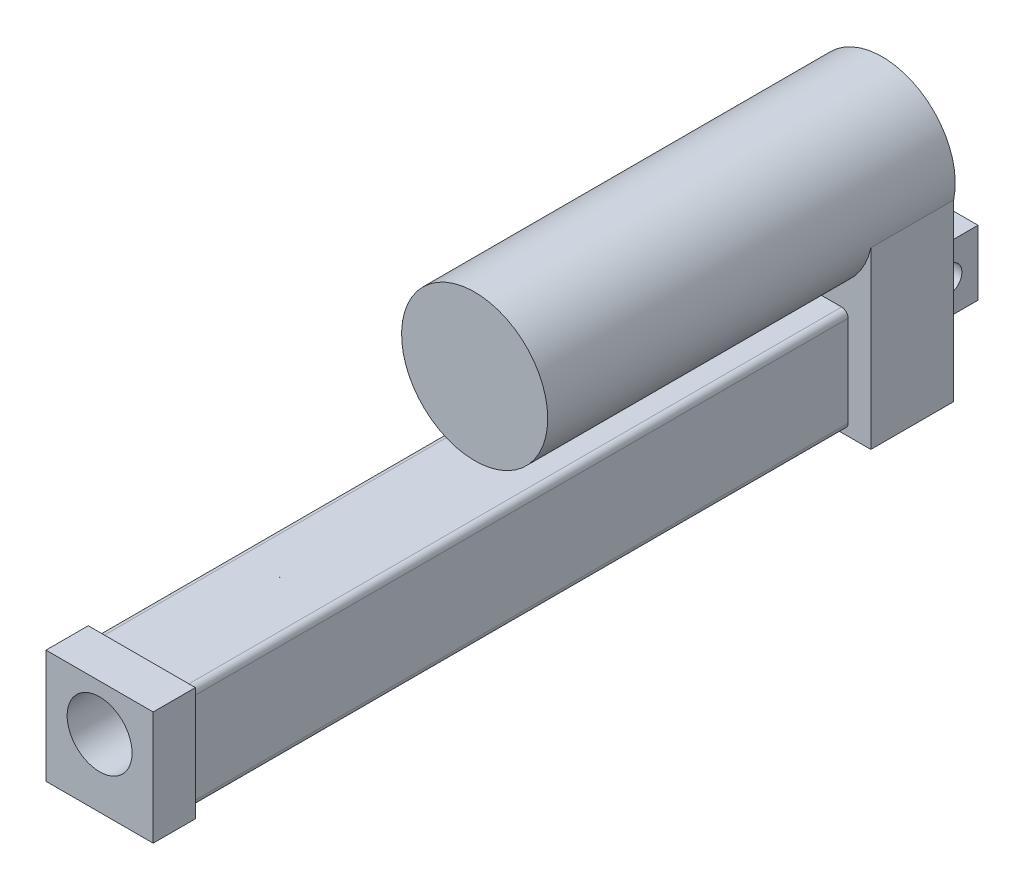
ISO-10303-21;
HEADER;
FILE_DESCRIPTION(('STEP AP214'),'2;1');
FILE_NAME('part.step','',(''),(''),'','','');
FILE_SCHEMA(('AUTOMOTIVE_DESIGN { 1 0 10303 214 1 1 1 1 }'));
ENDSEC;
DATA;
#1=APPLICATION_CONTEXT('core data for automotive mechanical design processes');
#2=APPLICATION_PROTOCOL_DEFINITION('international standard','automotive_design',2000,#1);
#3=PRODUCT_CONTEXT('',#1,'mechanical');
#4=PRODUCT('Part','Part','',(#3));
#5=PRODUCT_RELATED_PRODUCT_CATEGORY('part','',(#4));
#6=PRODUCT_DEFINITION_FORMATION('','',#4);
#7=PRODUCT_DEFINITION_CONTEXT('part definition',#1,'design');
#8=PRODUCT_DEFINITION('design','',#6,#7);
#9=PRODUCT_DEFINITION_SHAPE('','',#8);
#10=(LENGTH_UNIT() NAMED_UNIT(*) SI_UNIT(.MILLI.,.METRE.));
#11=(NAMED_UNIT(*) PLANE_ANGLE_UNIT() SI_UNIT($,.RADIAN.));
#12=(NAMED_UNIT(*) SI_UNIT($,.STERADIAN.) SOLID_ANGLE_UNIT());
#13=UNCERTAINTY_MEASURE_WITH_UNIT(LENGTH_MEASURE(1.E-05),#10,'distance_accuracy_value','');
#14=(GEOMETRIC_REPRESENTATION_CONTEXT(3) GLOBAL_UNCERTAINTY_ASSIGNED_CONTEXT((#13)) GLOBAL_UNIT_ASSIGNED_CONTEXT((#10,
#11,#12)) REPRESENTATION_CONTEXT('',''));
#15=CARTESIAN_POINT('',(0.,0.,0.));
#16=DIRECTION('',(0.,0.,1.));
#17=DIRECTION('',(1.,0.,0.));
#18=AXIS2_PLACEMENT_3D('',#15,#16,#17);
#19=CARTESIAN_POINT('',(15.,-57.,241.));
#20=DIRECTION('',(-1.,0.,0.));
#21=DIRECTION('',(0.,-1.,0.));
#22=AXIS2_PLACEMENT_3D('',#19,#20,#21);
#23=PLANE('',#22);
#24=DIRECTION('',(0.,1.,0.));
#25=VECTOR('',#24,1.);
#26=CARTESIAN_POINT('',(15.,-57.,228.));
#27=LINE('',#26,#25);
#28=CARTESIAN_POINT('',(15.,-55.,228.));
#29=VERTEX_POINT('',#28);
#30=CARTESIAN_POINT('',(15.,-27.,228.));
#31=VERTEX_POINT('',#30);
#32=EDGE_CURVE('E222',#29,#31,#27,.T.);
#33=ORIENTED_EDGE('',*,*,#32,.F.);
#34=DIRECTION('',(0.,0.,-1.));
#35=VECTOR('',#34,1.);
#36=CARTESIAN_POINT('',(15.,-55.,241.));
#37=LINE('',#36,#35);
#38=CARTESIAN_POINT('',(15.,-55.,25.5));
#39=VERTEX_POINT('',#38);
#40=EDGE_CURVE('E323',#29,#39,#37,.T.);
#41=ORIENTED_EDGE('',*,*,#40,.T.);
#42=DIRECTION('',(0.,1.,0.));
#43=VECTOR('',#42,1.);
#44=CARTESIAN_POINT('',(15.,-57.,25.5));
#45=LINE('',#44,#43);
#46=CARTESIAN_POINT('',(15.,-27.,25.5));
#47=VERTEX_POINT('',#46);
#48=EDGE_CURVE('E264',#39,#47,#45,.T.);
#49=ORIENTED_EDGE('',*,*,#48,.T.);
#50=DIRECTION('',(0.,0.,-1.));
#51=VECTOR('',#50,1.);
#52=CARTESIAN_POINT('',(15.,-27.,241.));
#53=LINE('',#52,#51);
#54=EDGE_CURVE('E321',#47,#31,#53,.F.);
#55=ORIENTED_EDGE('',*,*,#54,.T.);
#56=EDGE_LOOP('',(#33,#41,#49,#55));
#57=FACE_BOUND('',#56,.T.);
#58=ADVANCED_FACE('F33',(#57),#23,.F.);
#59=CARTESIAN_POINT('',(-15.,-25.,241.));
#60=DIRECTION('',(0.,-1.,0.));
#61=DIRECTION('',(0.,0.,-1.));
#62=AXIS2_PLACEMENT_3D('',#59,#60,#61);
#63=PLANE('',#62);
#64=DIRECTION('',(-1.,0.,0.));
#65=VECTOR('',#64,1.);
#66=CARTESIAN_POINT('',(-15.,-25.,25.5));
#67=LINE('',#66,#65);
#68=CARTESIAN_POINT('',(13.,-25.,25.5));
#69=VERTEX_POINT('',#68);
#70=CARTESIAN_POINT('',(-13.,-25.,25.5));
#71=VERTEX_POINT('',#70);
#72=EDGE_CURVE('E267',#69,#71,#67,.T.);
#73=ORIENTED_EDGE('',*,*,#72,.T.);
#74=DIRECTION('',(0.,0.,-1.));
#75=VECTOR('',#74,1.);
#76=CARTESIAN_POINT('',(-13.,-25.,241.));
#77=LINE('',#76,#75);
#78=CARTESIAN_POINT('',(-13.,-25.,228.));
#79=VERTEX_POINT('',#78);
#80=EDGE_CURVE('E328',#71,#79,#77,.F.);
#81=ORIENTED_EDGE('',*,*,#80,.T.);
#82=DIRECTION('',(-1.,0.,0.));
#83=VECTOR('',#82,1.);
#84=CARTESIAN_POINT('',(-15.,-25.,228.));
#85=LINE('',#84,#83);
#86=CARTESIAN_POINT('',(13.,-25.,228.));
#87=VERTEX_POINT('',#86);
#88=EDGE_CURVE('E219',#87,#79,#85,.T.);
#89=ORIENTED_EDGE('',*,*,#88,.F.);
#90=DIRECTION('',(0.,0.,-1.));
#91=VECTOR('',#90,1.);
#92=CARTESIAN_POINT('',(13.,-25.,241.));
#93=LINE('',#92,#91);
#94=EDGE_CURVE('E326',#87,#69,#93,.T.);
#95=ORIENTED_EDGE('',*,*,#94,.T.);
#96=EDGE_LOOP('',(#73,#81,#89,#95));
#97=FACE_BOUND('',#96,.T.);
#98=ADVANCED_FACE('F349',(#97),#63,.F.);
#99=CARTESIAN_POINT('',(-15.,-57.,241.));
#100=DIRECTION('',(1.,0.,0.));
#101=DIRECTION('',(0.,0.,-1.));
#102=AXIS2_PLACEMENT_3D('',#99,#100,#101);
#103=PLANE('',#102);
#104=DIRECTION('',(0.,-1.,0.));
#105=VECTOR('',#104,1.);
#106=CARTESIAN_POINT('',(-15.,-57.,25.5));
#107=LINE('',#106,#105);
#108=CARTESIAN_POINT('',(-15.,-27.,25.5));
#109=VERTEX_POINT('',#108);
#110=CARTESIAN_POINT('',(-15.,-55.,25.5));
#111=VERTEX_POINT('',#110);
#112=EDGE_CURVE('E269',#109,#111,#107,.T.);
#113=ORIENTED_EDGE('',*,*,#112,.T.);
#114=DIRECTION('',(0.,0.,-1.));
#115=VECTOR('',#114,1.);
#116=CARTESIAN_POINT('',(-15.,-55.,241.));
#117=LINE('',#116,#115);
#118=CARTESIAN_POINT('',(-15.,-55.,228.));
#119=VERTEX_POINT('',#118);
#120=EDGE_CURVE('E319',#111,#119,#117,.F.);
#121=ORIENTED_EDGE('',*,*,#120,.T.);
#122=DIRECTION('',(0.,-1.,0.));
#123=VECTOR('',#122,1.);
#124=CARTESIAN_POINT('',(-15.,-57.,228.));
#125=LINE('',#124,#123);
#126=CARTESIAN_POINT('',(-15.,-27.,228.));
#127=VERTEX_POINT('',#126);
#128=EDGE_CURVE('E213',#127,#119,#125,.T.);
#129=ORIENTED_EDGE('',*,*,#128,.F.);
#130=DIRECTION('',(0.,0.,-1.));
#131=VECTOR('',#130,1.);
#132=CARTESIAN_POINT('',(-15.,-27.,241.));
#133=LINE('',#132,#131);
#134=EDGE_CURVE('E316',#127,#109,#133,.T.);
#135=ORIENTED_EDGE('',*,*,#134,.T.);
#136=EDGE_LOOP('',(#113,#121,#129,#135));
#137=FACE_BOUND('',#136,.T.);
#138=ADVANCED_FACE('F357',(#137),#103,.F.);
#139=CARTESIAN_POINT('',(-15.,-57.,241.));
#140=DIRECTION('',(0.,1.,0.));
#141=DIRECTION('',(0.,0.,1.));
#142=AXIS2_PLACEMENT_3D('',#139,#140,#141);
#143=PLANE('',#142);
#144=DIRECTION('',(1.,0.,0.));
#145=VECTOR('',#144,1.);
#146=CARTESIAN_POINT('',(-15.,-57.,228.));
#147=LINE('',#146,#145);
#148=CARTESIAN_POINT('',(-13.,-57.,228.));
#149=VERTEX_POINT('',#148);
#150=CARTESIAN_POINT('',(13.,-57.,228.));
#151=VERTEX_POINT('',#150);
#152=EDGE_CURVE('E308',#149,#151,#147,.T.);
#153=ORIENTED_EDGE('',*,*,#152,.F.);
#154=DIRECTION('',(0.,0.,-1.));
#155=VECTOR('',#154,1.);
#156=CARTESIAN_POINT('',(-13.,-57.,241.));
#157=LINE('',#156,#155);
#158=CARTESIAN_POINT('',(-13.,-57.,25.5));
#159=VERTEX_POINT('',#158);
#160=EDGE_CURVE('E313',#149,#159,#157,.T.);
#161=ORIENTED_EDGE('',*,*,#160,.T.);
#162=DIRECTION('',(1.,0.,0.));
#163=VECTOR('',#162,1.);
#164=CARTESIAN_POINT('',(-15.,-57.,25.5));
#165=LINE('',#164,#163);
#166=CARTESIAN_POINT('',(13.,-57.,25.5));
#167=VERTEX_POINT('',#166);
#168=EDGE_CURVE('E272',#159,#167,#165,.T.);
#169=ORIENTED_EDGE('',*,*,#168,.T.);
#170=DIRECTION('',(0.,0.,-1.));
#171=VECTOR('',#170,1.);
#172=CARTESIAN_POINT('',(13.,-57.,241.));
#173=LINE('',#172,#171);
#174=EDGE_CURVE('E311',#167,#151,#173,.F.);
#175=ORIENTED_EDGE('',*,*,#174,.T.);
#176=EDGE_LOOP('',(#153,#161,#169,#175));
#177=FACE_BOUND('',#176,.T.);
#178=ADVANCED_FACE('F365',(#177),#143,.F.);
#179=CARTESIAN_POINT('',(0.,0.,0.));
#180=DIRECTION('',(0.,0.,1.));
#181=DIRECTION('',(1.,0.,0.));
#182=AXIS2_PLACEMENT_3D('',#179,#180,#181);
#183=PLANE('',#182);
#184=CARTESIAN_POINT('',(0.,0.,0.));
#185=DIRECTION('',(0.,0.,1.));
#186=DIRECTION('',(1.,0.,0.));
#187=AXIS2_PLACEMENT_3D('',#184,#185,#186);
#188=CIRCLE('',#187,22.5);
#189=CARTESIAN_POINT('',(22.,-4.71699056602834,0.));
#190=VERTEX_POINT('',#189);
#191=CARTESIAN_POINT('',(-22.,-4.71699056602834,0.));
#192=VERTEX_POINT('',#191);
#193=EDGE_CURVE('E279',#190,#192,#188,.T.);
#194=ORIENTED_EDGE('',*,*,#193,.F.);
#195=DIRECTION('',(0.,1.,0.));
#196=VECTOR('',#195,1.);
#197=CARTESIAN_POINT('',(22.,-58.5,0.));
#198=LINE('',#197,#196);
#199=CARTESIAN_POINT('',(22.,-58.5,0.));
#200=VERTEX_POINT('',#199);
#201=EDGE_CURVE('E285',#200,#190,#198,.T.);
#202=ORIENTED_EDGE('',*,*,#201,.F.);
#203=DIRECTION('',(1.,0.,0.));
#204=VECTOR('',#203,1.);
#205=CARTESIAN_POINT('',(-22.,-58.5,0.));
#206=LINE('',#205,#204);
#207=CARTESIAN_POINT('',(-22.,-58.5,0.));
#208=VERTEX_POINT('',#207);
#209=EDGE_CURVE('E294',#208,#200,#206,.T.);
#210=ORIENTED_EDGE('',*,*,#209,.F.);
#211=DIRECTION('',(0.,-1.,0.));
#212=VECTOR('',#211,1.);
#213=CARTESIAN_POINT('',(-22.,-4.71699056602834,0.));
#214=LINE('',#213,#212);
#215=EDGE_CURVE('E292',#192,#208,#214,.T.);
#216=ORIENTED_EDGE('',*,*,#215,.F.);
#217=EDGE_LOOP('',(#194,#202,#210,#216));
#218=FACE_BOUND('',#217,.T.);
#219=DIRECTION('',(0.,1.,0.));
#220=VECTOR('',#219,1.);
#221=CARTESIAN_POINT('',(-9.50000000000001,-47.7,0.));
#222=LINE('',#221,#220);
#223=CARTESIAN_POINT('',(-9.50000000000001,-47.7,0.));
#224=VERTEX_POINT('',#223);
#225=CARTESIAN_POINT('',(-9.50000000000001,-27.7,0.));
#226=VERTEX_POINT('',#225);
#227=EDGE_CURVE('E231',#224,#226,#222,.T.);
#228=ORIENTED_EDGE('',*,*,#227,.F.);
#229=DIRECTION('',(-1.,0.,0.));
#230=VECTOR('',#229,1.);
#231=CARTESIAN_POINT('',(9.49999999999999,-47.7,0.));
#232=LINE('',#231,#230);
#233=CARTESIAN_POINT('',(9.49999999999999,-47.7,0.));
#234=VERTEX_POINT('',#233);
#235=EDGE_CURVE('E236',#234,#224,#232,.T.);
#236=ORIENTED_EDGE('',*,*,#235,.F.);
#237=DIRECTION('',(0.,-1.,0.));
#238=VECTOR('',#237,1.);
#239=CARTESIAN_POINT('',(9.49999999999999,-47.7,0.));
#240=LINE('',#239,#238);
#241=CARTESIAN_POINT('',(9.49999999999999,-27.7,0.));
#242=VERTEX_POINT('',#241);
#243=EDGE_CURVE('E248',#242,#234,#240,.T.);
#244=ORIENTED_EDGE('',*,*,#243,.F.);
#245=DIRECTION('',(1.,0.,0.));
#246=VECTOR('',#245,1.);
#247=CARTESIAN_POINT('',(9.49999999999999,-27.7,0.));
#248=LINE('',#247,#246);
#249=EDGE_CURVE('E245',#226,#242,#248,.T.);
#250=ORIENTED_EDGE('',*,*,#249,.F.);
#251=EDGE_LOOP('',(#228,#236,#244,#250));
#252=FACE_BOUND('',#251,.T.);
#253=ADVANCED_FACE('F396',(#218,#252),#183,.F.);
#254=CARTESIAN_POINT('',(0.,0.,25.5));
#255=DIRECTION('',(0.,0.,1.));
#256=DIRECTION('',(1.,0.,0.));
#257=AXIS2_PLACEMENT_3D('',#254,#255,#256);
#258=PLANE('',#257);
#259=CARTESIAN_POINT('',(0.,0.,25.5));
#260=DIRECTION('',(0.,0.,1.));
#261=DIRECTION('',(1.,0.,0.));
#262=AXIS2_PLACEMENT_3D('',#259,#260,#261);
#263=CIRCLE('',#262,22.5);
#264=CARTESIAN_POINT('',(-22.,-4.71699056602834,25.5));
#265=VERTEX_POINT('',#264);
#266=CARTESIAN_POINT('',(22.,-4.71699056602834,25.5));
#267=VERTEX_POINT('',#266);
#268=EDGE_CURVE('E275',#265,#267,#263,.T.);
#269=ORIENTED_EDGE('',*,*,#268,.F.);
#270=DIRECTION('',(0.,-1.,0.));
#271=VECTOR('',#270,1.);
#272=CARTESIAN_POINT('',(-22.,-4.71699056602834,25.5));
#273=LINE('',#272,#271);
#274=CARTESIAN_POINT('',(-22.,-58.5,25.5));
#275=VERTEX_POINT('',#274);
#276=EDGE_CURVE('E282',#265,#275,#273,.T.);
#277=ORIENTED_EDGE('',*,*,#276,.T.);
#278=DIRECTION('',(1.,0.,0.));
#279=VECTOR('',#278,1.);
#280=CARTESIAN_POINT('',(-22.,-58.5,25.5));
#281=LINE('',#280,#279);
#282=CARTESIAN_POINT('',(22.,-58.5,25.5));
#283=VERTEX_POINT('',#282);
#284=EDGE_CURVE('E284',#275,#283,#281,.T.);
#285=ORIENTED_EDGE('',*,*,#284,.T.);
#286=DIRECTION('',(0.,1.,0.));
#287=VECTOR('',#286,1.);
#288=CARTESIAN_POINT('',(22.,-58.5,25.5));
#289=LINE('',#288,#287);
#290=EDGE_CURVE('E287',#283,#267,#289,.T.);
#291=ORIENTED_EDGE('',*,*,#290,.T.);
#292=EDGE_LOOP('',(#269,#277,#285,#291));
#293=FACE_BOUND('',#292,.T.);
#294=ORIENTED_EDGE('',*,*,#72,.F.);
#295=CARTESIAN_POINT('',(13.,-27.,25.5));
#296=DIRECTION('',(0.,0.,1.));
#297=DIRECTION('',(1.,0.,0.));
#298=AXIS2_PLACEMENT_3D('',#295,#296,#297);
#299=CIRCLE('',#298,2.);
#300=EDGE_CURVE('E41',#69,#47,#299,.F.);
#301=ORIENTED_EDGE('',*,*,#300,.T.);
#302=ORIENTED_EDGE('',*,*,#48,.F.);
#303=CARTESIAN_POINT('',(13.,-55.,25.5));
#304=DIRECTION('',(0.,0.,1.));
#305=DIRECTION('',(1.,0.,0.));
#306=AXIS2_PLACEMENT_3D('',#303,#304,#305);
#307=CIRCLE('',#306,2.);
#308=EDGE_CURVE('E334',#39,#167,#307,.F.);
#309=ORIENTED_EDGE('',*,*,#308,.T.);
#310=ORIENTED_EDGE('',*,*,#168,.F.);
#311=CARTESIAN_POINT('',(-13.,-55.,25.5));
#312=DIRECTION('',(0.,0.,1.));
#313=DIRECTION('',(1.,0.,0.));
#314=AXIS2_PLACEMENT_3D('',#311,#312,#313);
#315=CIRCLE('',#314,2.);
#316=EDGE_CURVE('E330',#159,#111,#315,.F.);
#317=ORIENTED_EDGE('',*,*,#316,.T.);
#318=ORIENTED_EDGE('',*,*,#112,.F.);
#319=CARTESIAN_POINT('',(-13.,-27.,25.5));
#320=DIRECTION('',(0.,0.,1.));
#321=DIRECTION('',(1.,0.,0.));
#322=AXIS2_PLACEMENT_3D('',#319,#320,#321);
#323=CIRCLE('',#322,2.);
#324=EDGE_CURVE('E48',#109,#71,#323,.F.);
#325=ORIENTED_EDGE('',*,*,#324,.T.);
#326=EDGE_LOOP('',(#294,#301,#302,#309,#310,#317,#318,#325));
#327=FACE_BOUND('',#326,.T.);
#328=ADVANCED_FACE('F341',(#293,#327),#258,.T.);
#329=CARTESIAN_POINT('',(0.,0.,25.5));
#330=DIRECTION('',(0.,0.,-1.));
#331=DIRECTION('',(-1.,0.,0.));
#332=AXIS2_PLACEMENT_3D('',#329,#330,#331);
#333=CYLINDRICAL_SURFACE('',#332,22.5);
#334=ORIENTED_EDGE('',*,*,#193,.T.);
#335=DIRECTION('',(0.,0.,-1.));
#336=VECTOR('',#335,1.);
#337=CARTESIAN_POINT('',(-22.,-4.71699056602834,25.5));
#338=LINE('',#337,#336);
#339=EDGE_CURVE('E305',#265,#192,#338,.T.);
#340=ORIENTED_EDGE('',*,*,#339,.F.);
#341=ORIENTED_EDGE('',*,*,#268,.T.);
#342=DIRECTION('',(0.,0.,-1.));
#343=VECTOR('',#342,1.);
#344=CARTESIAN_POINT('',(22.,-4.71699056602834,25.5));
#345=LINE('',#344,#343);
#346=EDGE_CURVE('E289',#267,#190,#345,.T.);
#347=ORIENTED_EDGE('',*,*,#346,.T.);
#348=EDGE_LOOP('',(#334,#340,#341,#347));
#349=FACE_BOUND('',#348,.T.);
#350=CARTESIAN_POINT('',(0.,0.,125.5));
#351=DIRECTION('',(0.,0.,1.));
#352=DIRECTION('',(1.,0.,0.));
#353=AXIS2_PLACEMENT_3D('',#350,#351,#352);
#354=CIRCLE('',#353,22.5);
#355=CARTESIAN_POINT('',(22.5,0.,125.5));
#356=VERTEX_POINT('',#355);
#357=EDGE_CURVE('E276',#356,#356,#354,.T.);
#358=ORIENTED_EDGE('',*,*,#357,.F.);
#359=EDGE_LOOP('',(#358));
#360=FACE_BOUND('',#359,.T.);
#361=ADVANCED_FACE('F395',(#349,#360),#333,.T.);
#362=CARTESIAN_POINT('',(-22.,-4.71699056602834,25.5));
#363=DIRECTION('',(1.,0.,0.));
#364=DIRECTION('',(0.,0.,-1.));
#365=AXIS2_PLACEMENT_3D('',#362,#363,#364);
#366=PLANE('',#365);
#367=ORIENTED_EDGE('',*,*,#215,.T.);
#368=DIRECTION('',(0.,0.,-1.));
#369=VECTOR('',#368,1.);
#370=CARTESIAN_POINT('',(-22.,-58.5,25.5));
#371=LINE('',#370,#369);
#372=EDGE_CURVE('E302',#275,#208,#371,.T.);
#373=ORIENTED_EDGE('',*,*,#372,.F.);
#374=ORIENTED_EDGE('',*,*,#276,.F.);
#375=ORIENTED_EDGE('',*,*,#339,.T.);
#376=EDGE_LOOP('',(#367,#373,#374,#375));
#377=FACE_BOUND('',#376,.T.);
#378=ADVANCED_FACE('F407',(#377),#366,.F.);
#379=CARTESIAN_POINT('',(-22.,-58.5,25.5));
#380=DIRECTION('',(0.,1.,0.));
#381=DIRECTION('',(-1.,0.,0.));
#382=AXIS2_PLACEMENT_3D('',#379,#380,#381);
#383=PLANE('',#382);
#384=ORIENTED_EDGE('',*,*,#209,.T.);
#385=DIRECTION('',(0.,0.,-1.));
#386=VECTOR('',#385,1.);
#387=CARTESIAN_POINT('',(22.,-58.5,25.5));
#388=LINE('',#387,#386);
#389=EDGE_CURVE('E299',#283,#200,#388,.T.);
#390=ORIENTED_EDGE('',*,*,#389,.F.);
#391=ORIENTED_EDGE('',*,*,#284,.F.);
#392=ORIENTED_EDGE('',*,*,#372,.T.);
#393=EDGE_LOOP('',(#384,#390,#391,#392));
#394=FACE_BOUND('',#393,.T.);
#395=ADVANCED_FACE('F403',(#394),#383,.F.);
#396=CARTESIAN_POINT('',(22.,-58.5,25.5));
#397=DIRECTION('',(-1.,0.,0.));
#398=DIRECTION('',(0.,-1.,0.));
#399=AXIS2_PLACEMENT_3D('',#396,#397,#398);
#400=PLANE('',#399);
#401=ORIENTED_EDGE('',*,*,#201,.T.);
#402=ORIENTED_EDGE('',*,*,#346,.F.);
#403=ORIENTED_EDGE('',*,*,#290,.F.);
#404=ORIENTED_EDGE('',*,*,#389,.T.);
#405=EDGE_LOOP('',(#401,#402,#403,#404));
#406=FACE_BOUND('',#405,.T.);
#407=ADVANCED_FACE('F391',(#406),#400,.F.);
#408=CARTESIAN_POINT('',(0.,0.,125.5));
#409=DIRECTION('',(0.,0.,1.));
#410=DIRECTION('',(1.,0.,0.));
#411=AXIS2_PLACEMENT_3D('',#408,#409,#410);
#412=PLANE('',#411);
#413=ORIENTED_EDGE('',*,*,#357,.T.);
#414=EDGE_LOOP('',(#413));
#415=FACE_BOUND('',#414,.T.);
#416=ADVANCED_FACE('F387',(#415),#412,.T.);
#417=CARTESIAN_POINT('',(-9.50000000000001,-47.7,-20.));
#418=DIRECTION('',(1.,0.,0.));
#419=DIRECTION('',(0.,0.,-1.));
#420=AXIS2_PLACEMENT_3D('',#417,#418,#419);
#421=PLANE('',#420);
#422=CARTESIAN_POINT('',(-9.50000000000001,-37.7,-11.));
#423=DIRECTION('',(1.,0.,0.));
#424=DIRECTION('',(0.,0.,-1.));
#425=AXIS2_PLACEMENT_3D('',#422,#423,#424);
#426=CIRCLE('',#425,4.05);
#427=CARTESIAN_POINT('',(-9.50000000000001,-37.7,-15.05));
#428=VERTEX_POINT('',#427);
#429=EDGE_CURVE('E228',#428,#428,#426,.T.);
#430=ORIENTED_EDGE('',*,*,#429,.T.);
#431=EDGE_LOOP('',(#430));
#432=FACE_BOUND('',#431,.T.);
#433=ORIENTED_EDGE('',*,*,#227,.T.);
#434=DIRECTION('',(0.,0.,1.));
#435=VECTOR('',#434,1.);
#436=CARTESIAN_POINT('',(-9.50000000000001,-27.7,-20.));
#437=LINE('',#436,#435);
#438=CARTESIAN_POINT('',(-9.50000000000001,-27.7,-20.));
#439=VERTEX_POINT('',#438);
#440=EDGE_CURVE('E261',#439,#226,#437,.T.);
#441=ORIENTED_EDGE('',*,*,#440,.F.);
#442=DIRECTION('',(0.,1.,0.));
#443=VECTOR('',#442,1.);
#444=CARTESIAN_POINT('',(-9.50000000000001,-47.7,-20.));
#445=LINE('',#444,#443);
#446=CARTESIAN_POINT('',(-9.50000000000001,-47.7,-20.));
#447=VERTEX_POINT('',#446);
#448=EDGE_CURVE('E232',#447,#439,#445,.T.);
#449=ORIENTED_EDGE('',*,*,#448,.F.);
#450=DIRECTION('',(0.,0.,1.));
#451=VECTOR('',#450,1.);
#452=CARTESIAN_POINT('',(-9.50000000000001,-47.7,-20.));
#453=LINE('',#452,#451);
#454=EDGE_CURVE('E242',#447,#224,#453,.T.);
#455=ORIENTED_EDGE('',*,*,#454,.T.);
#456=EDGE_LOOP('',(#433,#441,#449,#455));
#457=FACE_BOUND('',#456,.T.);
#458=ADVANCED_FACE('F390',(#432,#457),#421,.F.);
#459=CARTESIAN_POINT('',(9.49999999999999,-27.7,-20.));
#460=DIRECTION('',(0.,-1.,0.));
#461=DIRECTION('',(0.,0.,-1.));
#462=AXIS2_PLACEMENT_3D('',#459,#460,#461);
#463=PLANE('',#462);
#464=ORIENTED_EDGE('',*,*,#249,.T.);
#465=DIRECTION('',(0.,0.,1.));
#466=VECTOR('',#465,1.);
#467=CARTESIAN_POINT('',(9.49999999999999,-27.7,-20.));
#468=LINE('',#467,#466);
#469=CARTESIAN_POINT('',(9.49999999999999,-27.7,-20.));
#470=VERTEX_POINT('',#469);
#471=EDGE_CURVE('E258',#470,#242,#468,.T.);
#472=ORIENTED_EDGE('',*,*,#471,.F.);
#473=DIRECTION('',(1.,0.,0.));
#474=VECTOR('',#473,1.);
#475=CARTESIAN_POINT('',(9.49999999999999,-27.7,-20.));
#476=LINE('',#475,#474);
#477=EDGE_CURVE('E235',#439,#470,#476,.T.);
#478=ORIENTED_EDGE('',*,*,#477,.F.);
#479=ORIENTED_EDGE('',*,*,#440,.T.);
#480=EDGE_LOOP('',(#464,#472,#478,#479));
#481=FACE_BOUND('',#480,.T.);
#482=ADVANCED_FACE('F445',(#481),#463,.F.);
#483=CARTESIAN_POINT('',(9.49999999999999,-47.7,-20.));
#484=DIRECTION('',(-1.,0.,0.));
#485=DIRECTION('',(0.,0.,1.));
#486=AXIS2_PLACEMENT_3D('',#483,#484,#485);
#487=PLANE('',#486);
#488=CARTESIAN_POINT('',(9.49999999999999,-37.7,-11.));
#489=DIRECTION('',(1.,0.,0.));
#490=DIRECTION('',(0.,0.,-1.));
#491=AXIS2_PLACEMENT_3D('',#488,#489,#490);
#492=CIRCLE('',#491,4.05);
#493=CARTESIAN_POINT('',(9.49999999999999,-37.7,-15.05));
#494=VERTEX_POINT('',#493);
#495=EDGE_CURVE('E225',#494,#494,#492,.T.);
#496=ORIENTED_EDGE('',*,*,#495,.F.);
#497=EDGE_LOOP('',(#496));
#498=FACE_BOUND('',#497,.T.);
#499=ORIENTED_EDGE('',*,*,#243,.T.);
#500=DIRECTION('',(0.,0.,1.));
#501=VECTOR('',#500,1.);
#502=CARTESIAN_POINT('',(9.49999999999999,-47.7,-20.));
#503=LINE('',#502,#501);
#504=CARTESIAN_POINT('',(9.49999999999999,-47.7,-20.));
#505=VERTEX_POINT('',#504);
#506=EDGE_CURVE('E255',#505,#234,#503,.T.);
#507=ORIENTED_EDGE('',*,*,#506,.F.);
#508=DIRECTION('',(0.,-1.,0.));
#509=VECTOR('',#508,1.);
#510=CARTESIAN_POINT('',(9.49999999999999,-47.7,-20.));
#511=LINE('',#510,#509);
#512=EDGE_CURVE('E238',#470,#505,#511,.T.);
#513=ORIENTED_EDGE('',*,*,#512,.F.);
#514=ORIENTED_EDGE('',*,*,#471,.T.);
#515=EDGE_LOOP('',(#499,#507,#513,#514));
#516=FACE_BOUND('',#515,.T.);
#517=ADVANCED_FACE('F443',(#498,#516),#487,.F.);
#518=CARTESIAN_POINT('',(9.49999999999999,-47.7,-20.));
#519=DIRECTION('',(0.,1.,0.));
#520=DIRECTION('',(0.,0.,1.));
#521=AXIS2_PLACEMENT_3D('',#518,#519,#520);
#522=PLANE('',#521);
#523=ORIENTED_EDGE('',*,*,#235,.T.);
#524=ORIENTED_EDGE('',*,*,#454,.F.);
#525=DIRECTION('',(-1.,0.,0.));
#526=VECTOR('',#525,1.);
#527=CARTESIAN_POINT('',(9.49999999999999,-47.7,-20.));
#528=LINE('',#527,#526);
#529=EDGE_CURVE('E240',#505,#447,#528,.T.);
#530=ORIENTED_EDGE('',*,*,#529,.F.);
#531=ORIENTED_EDGE('',*,*,#506,.T.);
#532=EDGE_LOOP('',(#523,#524,#530,#531));
#533=FACE_BOUND('',#532,.T.);
#534=ADVANCED_FACE('F434',(#533),#522,.F.);
#535=CARTESIAN_POINT('',(0.,0.,-20.));
#536=DIRECTION('',(0.,0.,1.));
#537=DIRECTION('',(1.,0.,0.));
#538=AXIS2_PLACEMENT_3D('',#535,#536,#537);
#539=PLANE('',#538);
#540=ORIENTED_EDGE('',*,*,#448,.T.);
#541=ORIENTED_EDGE('',*,*,#477,.T.);
#542=ORIENTED_EDGE('',*,*,#512,.T.);
#543=ORIENTED_EDGE('',*,*,#529,.T.);
#544=EDGE_LOOP('',(#540,#541,#542,#543));
#545=FACE_BOUND('',#544,.T.);
#546=ADVANCED_FACE('F439',(#545),#539,.F.);
#547=CARTESIAN_POINT('',(-22.5,-37.7,-11.));
#548=DIRECTION('',(1.,0.,0.));
#549=DIRECTION('',(0.,0.,-1.));
#550=AXIS2_PLACEMENT_3D('',#547,#548,#549);
#551=CYLINDRICAL_SURFACE('',#550,4.05);
#552=ORIENTED_EDGE('',*,*,#495,.T.);
#553=EDGE_LOOP('',(#552));
#554=FACE_BOUND('',#553,.T.);
#555=ORIENTED_EDGE('',*,*,#429,.F.);
#556=EDGE_LOOP('',(#555));
#557=FACE_BOUND('',#556,.T.);
#558=ADVANCED_FACE('F480',(#554,#557),#551,.F.);
#559=CARTESIAN_POINT('',(0.,0.,228.));
#560=DIRECTION('',(0.,0.,1.));
#561=DIRECTION('',(1.,0.,0.));
#562=AXIS2_PLACEMENT_3D('',#559,#560,#561);
#563=PLANE('',#562);
#564=DIRECTION('',(1.,0.,0.));
#565=VECTOR('',#564,1.);
#566=CARTESIAN_POINT('',(-16.5,-58.5,228.));
#567=LINE('',#566,#565);
#568=CARTESIAN_POINT('',(-16.5,-58.5,228.));
#569=VERTEX_POINT('',#568);
#570=CARTESIAN_POINT('',(16.5,-58.5,228.));
#571=VERTEX_POINT('',#570);
#572=EDGE_CURVE('E189',#569,#571,#567,.T.);
#573=ORIENTED_EDGE('',*,*,#572,.F.);
#574=DIRECTION('',(0.,-1.,0.));
#575=VECTOR('',#574,1.);
#576=CARTESIAN_POINT('',(-16.5,-23.5,228.));
#577=LINE('',#576,#575);
#578=CARTESIAN_POINT('',(-16.5,-23.5,228.));
#579=VERTEX_POINT('',#578);
#580=EDGE_CURVE('E181',#579,#569,#577,.T.);
#581=ORIENTED_EDGE('',*,*,#580,.F.);
#582=DIRECTION('',(-1.,0.,0.));
#583=VECTOR('',#582,1.);
#584=CARTESIAN_POINT('',(16.5,-23.5,228.));
#585=LINE('',#584,#583);
#586=CARTESIAN_POINT('',(16.5,-23.5,228.));
#587=VERTEX_POINT('',#586);
#588=EDGE_CURVE('E192',#587,#579,#585,.T.);
#589=ORIENTED_EDGE('',*,*,#588,.F.);
#590=DIRECTION('',(0.,1.,0.));
#591=VECTOR('',#590,1.);
#592=CARTESIAN_POINT('',(16.5,-58.5,228.));
#593=LINE('',#592,#591);
#594=EDGE_CURVE('E173',#571,#587,#593,.T.);
#595=ORIENTED_EDGE('',*,*,#594,.F.);
#596=EDGE_LOOP('',(#573,#581,#589,#595));
#597=FACE_BOUND('',#596,.T.);
#598=ORIENTED_EDGE('',*,*,#128,.T.);
#599=CARTESIAN_POINT('',(-13.,-55.,228.));
#600=DIRECTION('',(0.,0.,1.));
#601=DIRECTION('',(1.,0.,0.));
#602=AXIS2_PLACEMENT_3D('',#599,#600,#601);
#603=CIRCLE('',#602,2.);
#604=EDGE_CURVE('E332',#119,#149,#603,.T.);
#605=ORIENTED_EDGE('',*,*,#604,.T.);
#606=ORIENTED_EDGE('',*,*,#152,.T.);
#607=CARTESIAN_POINT('',(13.,-55.,228.));
#608=DIRECTION('',(0.,0.,1.));
#609=DIRECTION('',(1.,0.,0.));
#610=AXIS2_PLACEMENT_3D('',#607,#608,#609);
#611=CIRCLE('',#610,2.);
#612=EDGE_CURVE('E336',#151,#29,#611,.T.);
#613=ORIENTED_EDGE('',*,*,#612,.T.);
#614=ORIENTED_EDGE('',*,*,#32,.T.);
#615=CARTESIAN_POINT('',(13.,-27.,228.));
#616=DIRECTION('',(0.,0.,1.));
#617=DIRECTION('',(1.,0.,0.));
#618=AXIS2_PLACEMENT_3D('',#615,#616,#617);
#619=CIRCLE('',#618,2.);
#620=EDGE_CURVE('E11',#31,#87,#619,.T.);
#621=ORIENTED_EDGE('',*,*,#620,.T.);
#622=ORIENTED_EDGE('',*,*,#88,.T.);
#623=CARTESIAN_POINT('',(-13.,-27.,228.));
#624=DIRECTION('',(0.,0.,1.));
#625=DIRECTION('',(1.,0.,0.));
#626=AXIS2_PLACEMENT_3D('',#623,#624,#625);
#627=CIRCLE('',#626,2.);
#628=EDGE_CURVE('E339',#79,#127,#627,.T.);
#629=ORIENTED_EDGE('',*,*,#628,.T.);
#630=EDGE_LOOP('',(#598,#605,#606,#613,#614,#621,#622,#629));
#631=FACE_BOUND('',#630,.T.);
#632=ADVANCED_FACE('F186',(#597,#631),#563,.F.);
#633=CARTESIAN_POINT('',(-16.5,-58.5,228.));
#634=DIRECTION('',(0.,-1.,0.));
#635=DIRECTION('',(0.,0.,-1.));
#636=AXIS2_PLACEMENT_3D('',#633,#634,#635);
#637=PLANE('',#636);
#638=DIRECTION('',(1.,0.,0.));
#639=VECTOR('',#638,1.);
#640=CARTESIAN_POINT('',(-16.5,-58.5,241.));
#641=LINE('',#640,#639);
#642=CARTESIAN_POINT('',(-16.5,-58.5,241.));
#643=VERTEX_POINT('',#642);
#644=CARTESIAN_POINT('',(16.5,-58.5,241.));
#645=VERTEX_POINT('',#644);
#646=EDGE_CURVE('E207',#643,#645,#641,.T.);
#647=ORIENTED_EDGE('',*,*,#646,.F.);
#648=DIRECTION('',(0.,0.,1.));
#649=VECTOR('',#648,1.);
#650=CARTESIAN_POINT('',(-16.5,-58.5,228.));
#651=LINE('',#650,#649);
#652=EDGE_CURVE('E195',#569,#643,#651,.T.);
#653=ORIENTED_EDGE('',*,*,#652,.F.);
#654=ORIENTED_EDGE('',*,*,#572,.T.);
#655=DIRECTION('',(0.,0.,1.));
#656=VECTOR('',#655,1.);
#657=CARTESIAN_POINT('',(16.5,-58.5,228.));
#658=LINE('',#657,#656);
#659=EDGE_CURVE('E170',#571,#645,#658,.T.);
#660=ORIENTED_EDGE('',*,*,#659,.T.);
#661=EDGE_LOOP('',(#647,#653,#654,#660));
#662=FACE_BOUND('',#661,.T.);
#663=ADVANCED_FACE('F194',(#662),#637,.T.);
#664=CARTESIAN_POINT('',(-16.5,-23.5,228.));
#665=DIRECTION('',(-1.,0.,0.));
#666=DIRECTION('',(0.,0.,1.));
#667=AXIS2_PLACEMENT_3D('',#664,#665,#666);
#668=PLANE('',#667);
#669=DIRECTION('',(0.,-1.,0.));
#670=VECTOR('',#669,1.);
#671=CARTESIAN_POINT('',(-16.5,-23.5,241.));
#672=LINE('',#671,#670);
#673=CARTESIAN_POINT('',(-16.5,-23.5,241.));
#674=VERTEX_POINT('',#673);
#675=EDGE_CURVE('E196',#674,#643,#672,.T.);
#676=ORIENTED_EDGE('',*,*,#675,.F.);
#677=DIRECTION('',(0.,0.,1.));
#678=VECTOR('',#677,1.);
#679=CARTESIAN_POINT('',(-16.5,-23.5,228.));
#680=LINE('',#679,#678);
#681=EDGE_CURVE('E214',#579,#674,#680,.T.);
#682=ORIENTED_EDGE('',*,*,#681,.F.);
#683=ORIENTED_EDGE('',*,*,#580,.T.);
#684=ORIENTED_EDGE('',*,*,#652,.T.);
#685=EDGE_LOOP('',(#676,#682,#683,#684));
#686=FACE_BOUND('',#685,.T.);
#687=ADVANCED_FACE('F531',(#686),#668,.T.);
#688=CARTESIAN_POINT('',(16.5,-23.5,228.));
#689=DIRECTION('',(0.,1.,0.));
#690=DIRECTION('',(0.,0.,1.));
#691=AXIS2_PLACEMENT_3D('',#688,#689,#690);
#692=PLANE('',#691);
#693=DIRECTION('',(-1.,0.,0.));
#694=VECTOR('',#693,1.);
#695=CARTESIAN_POINT('',(16.5,-23.5,241.));
#696=LINE('',#695,#694);
#697=CARTESIAN_POINT('',(16.5,-23.5,241.));
#698=VERTEX_POINT('',#697);
#699=EDGE_CURVE('E199',#698,#674,#696,.T.);
#700=ORIENTED_EDGE('',*,*,#699,.F.);
#701=DIRECTION('',(0.,0.,1.));
#702=VECTOR('',#701,1.);
#703=CARTESIAN_POINT('',(16.5,-23.5,228.));
#704=LINE('',#703,#702);
#705=EDGE_CURVE('E180',#587,#698,#704,.T.);
#706=ORIENTED_EDGE('',*,*,#705,.F.);
#707=ORIENTED_EDGE('',*,*,#588,.T.);
#708=ORIENTED_EDGE('',*,*,#681,.T.);
#709=EDGE_LOOP('',(#700,#706,#707,#708));
#710=FACE_BOUND('',#709,.T.);
#711=ADVANCED_FACE('F534',(#710),#692,.T.);
#712=CARTESIAN_POINT('',(16.5,-58.5,228.));
#713=DIRECTION('',(1.,0.,0.));
#714=DIRECTION('',(0.,1.,0.));
#715=AXIS2_PLACEMENT_3D('',#712,#713,#714);
#716=PLANE('',#715);
#717=DIRECTION('',(0.,1.,0.));
#718=VECTOR('',#717,1.);
#719=CARTESIAN_POINT('',(16.5,-58.5,241.));
#720=LINE('',#719,#718);
#721=EDGE_CURVE('E175',#645,#698,#720,.T.);
#722=ORIENTED_EDGE('',*,*,#721,.F.);
#723=ORIENTED_EDGE('',*,*,#659,.F.);
#724=ORIENTED_EDGE('',*,*,#594,.T.);
#725=ORIENTED_EDGE('',*,*,#705,.T.);
#726=EDGE_LOOP('',(#722,#723,#724,#725));
#727=FACE_BOUND('',#726,.T.);
#728=ADVANCED_FACE('F172',(#727),#716,.T.);
#729=CARTESIAN_POINT('',(0.,0.,241.));
#730=DIRECTION('',(0.,0.,-1.));
#731=DIRECTION('',(-1.,0.,0.));
#732=AXIS2_PLACEMENT_3D('',#729,#730,#731);
#733=PLANE('',#732);
#734=CARTESIAN_POINT('',(0.,-37.7,241.));
#735=DIRECTION('',(0.,0.,-1.));
#736=DIRECTION('',(-1.,0.,0.));
#737=AXIS2_PLACEMENT_3D('',#734,#735,#736);
#738=CIRCLE('',#737,10.);
#739=CARTESIAN_POINT('',(-10.,-37.7,241.));
#740=VERTEX_POINT('',#739);
#741=EDGE_CURVE('E202',#740,#740,#738,.T.);
#742=ORIENTED_EDGE('',*,*,#741,.T.);
#743=EDGE_LOOP('',(#742));
#744=FACE_BOUND('',#743,.T.);
#745=ORIENTED_EDGE('',*,*,#646,.T.);
#746=ORIENTED_EDGE('',*,*,#721,.T.);
#747=ORIENTED_EDGE('',*,*,#699,.T.);
#748=ORIENTED_EDGE('',*,*,#675,.T.);
#749=EDGE_LOOP('',(#745,#746,#747,#748));
#750=FACE_BOUND('',#749,.T.);
#751=ADVANCED_FACE('F376',(#744,#750),#733,.F.);
#752=CARTESIAN_POINT('',(-13.,-55.,241.));
#753=DIRECTION('',(0.,0.,-1.));
#754=DIRECTION('',(-1.,0.,0.));
#755=AXIS2_PLACEMENT_3D('',#752,#753,#754);
#756=CYLINDRICAL_SURFACE('',#755,2.);
#757=ORIENTED_EDGE('',*,*,#604,.F.);
#758=ORIENTED_EDGE('',*,*,#120,.F.);
#759=ORIENTED_EDGE('',*,*,#316,.F.);
#760=ORIENTED_EDGE('',*,*,#160,.F.);
#761=EDGE_LOOP('',(#757,#758,#759,#760));
#762=FACE_BOUND('',#761,.T.);
#763=ADVANCED_FACE('F360',(#762),#756,.T.);
#764=CARTESIAN_POINT('',(13.,-55.,241.));
#765=DIRECTION('',(0.,0.,-1.));
#766=DIRECTION('',(-1.,0.,0.));
#767=AXIS2_PLACEMENT_3D('',#764,#765,#766);
#768=CYLINDRICAL_SURFACE('',#767,2.);
#769=ORIENTED_EDGE('',*,*,#612,.F.);
#770=ORIENTED_EDGE('',*,*,#174,.F.);
#771=ORIENTED_EDGE('',*,*,#308,.F.);
#772=ORIENTED_EDGE('',*,*,#40,.F.);
#773=EDGE_LOOP('',(#769,#770,#771,#772));
#774=FACE_BOUND('',#773,.T.);
#775=ADVANCED_FACE('F369',(#774),#768,.T.);
#776=CARTESIAN_POINT('',(-13.,-27.,241.));
#777=DIRECTION('',(0.,0.,-1.));
#778=DIRECTION('',(-1.,0.,0.));
#779=AXIS2_PLACEMENT_3D('',#776,#777,#778);
#780=CYLINDRICAL_SURFACE('',#779,2.);
#781=ORIENTED_EDGE('',*,*,#628,.F.);
#782=ORIENTED_EDGE('',*,*,#80,.F.);
#783=ORIENTED_EDGE('',*,*,#324,.F.);
#784=ORIENTED_EDGE('',*,*,#134,.F.);
#785=EDGE_LOOP('',(#781,#782,#783,#784));
#786=FACE_BOUND('',#785,.T.);
#787=ADVANCED_FACE('F352',(#786),#780,.T.);
#788=CARTESIAN_POINT('',(13.,-27.,241.));
#789=DIRECTION('',(0.,0.,-1.));
#790=DIRECTION('',(-1.,0.,0.));
#791=AXIS2_PLACEMENT_3D('',#788,#789,#790);
#792=CYLINDRICAL_SURFACE('',#791,2.);
#793=ORIENTED_EDGE('',*,*,#620,.F.);
#794=ORIENTED_EDGE('',*,*,#54,.F.);
#795=ORIENTED_EDGE('',*,*,#300,.F.);
#796=ORIENTED_EDGE('',*,*,#94,.F.);
#797=EDGE_LOOP('',(#793,#794,#795,#796));
#798=FACE_BOUND('',#797,.T.);
#799=ADVANCED_FACE('F35',(#798),#792,.T.);
#800=CARTESIAN_POINT('',(0.,-37.7,166.));
#801=DIRECTION('',(0.,0.,1.));
#802=DIRECTION('',(1.,0.,0.));
#803=AXIS2_PLACEMENT_3D('',#800,#801,#802);
#804=CYLINDRICAL_SURFACE('',#803,10.);
#805=CARTESIAN_POINT('',(0.,-37.7,166.));
#806=DIRECTION('',(0.,0.,1.));
#807=DIRECTION('',(1.,0.,0.));
#808=AXIS2_PLACEMENT_3D('',#805,#806,#807);
#809=CIRCLE('',#808,10.);
#810=CARTESIAN_POINT('',(10.,-37.7,166.));
#811=VERTEX_POINT('',#810);
#812=EDGE_CURVE('E671',#811,#811,#809,.T.);
#813=ORIENTED_EDGE('',*,*,#812,.F.);
#814=EDGE_LOOP('',(#813));
#815=FACE_BOUND('',#814,.T.);
#816=ORIENTED_EDGE('',*,*,#741,.F.);
#817=EDGE_LOOP('',(#816));
#818=FACE_BOUND('',#817,.T.);
#819=ADVANCED_FACE('F507',(#815,#818),#804,.F.);
#820=CARTESIAN_POINT('',(0.,-37.7,166.));
#821=DIRECTION('',(0.,0.,1.));
#822=DIRECTION('',(1.,0.,0.));
#823=AXIS2_PLACEMENT_3D('',#820,#821,#822);
#824=PLANE('',#823);
#825=ORIENTED_EDGE('',*,*,#812,.T.);
#826=EDGE_LOOP('',(#825));
#827=FACE_BOUND('',#826,.T.);
#828=ADVANCED_FACE('F515',(#827),#824,.T.);
#829=CLOSED_SHELL('',(#58,#98,#138,#178,#253,#328,#361,#378,#395,#407,#416,#458,#482,#517,#534,
#546,#558,#632,#663,#687,#711,#728,#751,#763,#775,#787,#799,#819,#828));
#830=MANIFOLD_SOLID_BREP('B2',#829);
#831=ADVANCED_BREP_SHAPE_REPRESENTATION('',(#18,#830),#14);
#832=SHAPE_DEFINITION_REPRESENTATION(#9,#831);
ENDSEC;
END-ISO-10303-21;
